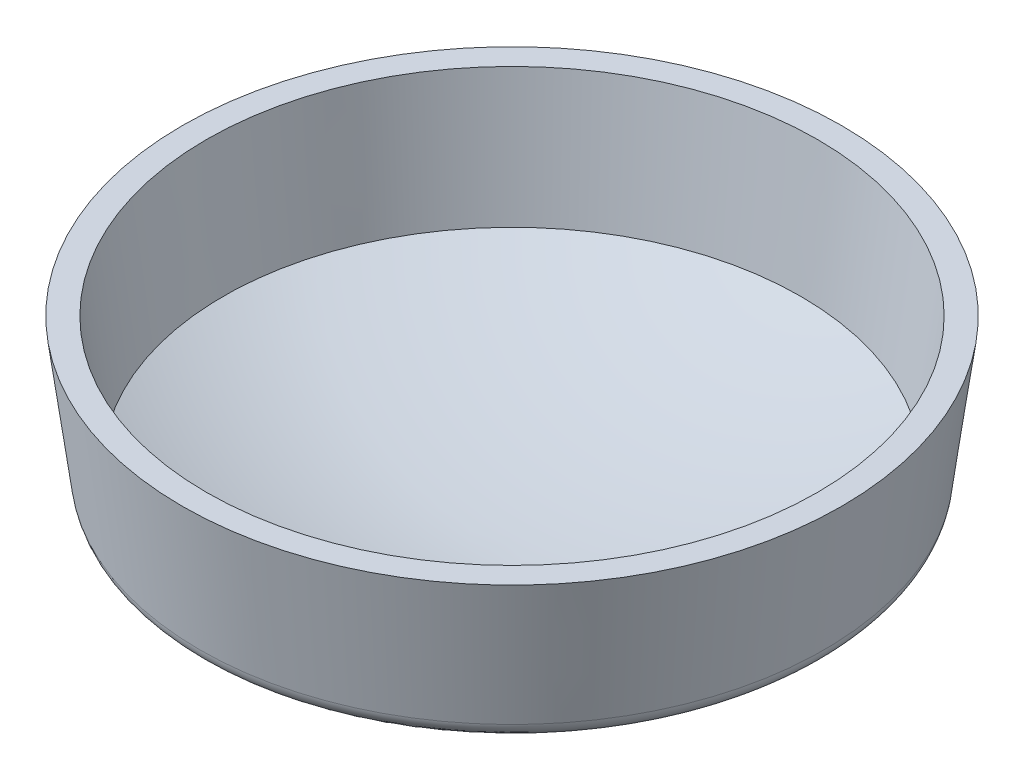
ISO-10303-21;
HEADER;
FILE_DESCRIPTION(('STEP AP214'),'2;1');
FILE_NAME('part.step','',(''),(''),'','','');
FILE_SCHEMA(('AUTOMOTIVE_DESIGN { 1 0 10303 214 1 1 1 1 }'));
ENDSEC;
DATA;
#1=APPLICATION_CONTEXT('core data for automotive mechanical design processes');
#2=APPLICATION_PROTOCOL_DEFINITION('international standard','automotive_design',2000,#1);
#3=PRODUCT_CONTEXT('',#1,'mechanical');
#4=PRODUCT('Part','Part','',(#3));
#5=PRODUCT_RELATED_PRODUCT_CATEGORY('part','',(#4));
#6=PRODUCT_DEFINITION_FORMATION('','',#4);
#7=PRODUCT_DEFINITION_CONTEXT('part definition',#1,'design');
#8=PRODUCT_DEFINITION('design','',#6,#7);
#9=PRODUCT_DEFINITION_SHAPE('','',#8);
#10=(LENGTH_UNIT() NAMED_UNIT(*) SI_UNIT(.MILLI.,.METRE.));
#11=(NAMED_UNIT(*) PLANE_ANGLE_UNIT() SI_UNIT($,.RADIAN.));
#12=(NAMED_UNIT(*) SI_UNIT($,.STERADIAN.) SOLID_ANGLE_UNIT());
#13=UNCERTAINTY_MEASURE_WITH_UNIT(LENGTH_MEASURE(1.E-05),#10,'distance_accuracy_value','');
#14=(GEOMETRIC_REPRESENTATION_CONTEXT(3) GLOBAL_UNCERTAINTY_ASSIGNED_CONTEXT((#13)) GLOBAL_UNIT_ASSIGNED_CONTEXT((#10,
#11,#12)) REPRESENTATION_CONTEXT('',''));
#15=CARTESIAN_POINT('',(0.,0.,0.));
#16=DIRECTION('',(0.,0.,1.));
#17=DIRECTION('',(1.,0.,0.));
#18=AXIS2_PLACEMENT_3D('',#15,#16,#17);
#19=CARTESIAN_POINT('',(0.,84.6666666666666,0.));
#20=DIRECTION('',(0.,0.,1.));
#21=DIRECTION('',(1.,0.,0.));
#22=AXIS2_PLACEMENT_3D('',#19,#20,#21);
#23=SPHERICAL_SURFACE('',#22,94.1916666666666);
#24=CARTESIAN_POINT('',(0.,84.6666666666666,0.));
#25=DIRECTION('',(0.,1.,0.));
#26=DIRECTION('',(0.,0.,1.));
#27=AXIS2_PLACEMENT_3D('',#24,#25,#26);
#28=SPHERICAL_SURFACE('',#27,94.1916666666666);
#29=CARTESIAN_POINT('',(0.,-0.602217901743057,0.));
#30=DIRECTION('',(0.,1.,0.));
#31=DIRECTION('',(0.,0.,1.));
#32=AXIS2_PLACEMENT_3D('',#29,#30,#31);
#33=CIRCLE('',#32,40.0160891880212);
#34=CARTESIAN_POINT('',(0.,-0.602217901743062,40.0160891880212));
#35=VERTEX_POINT('',#34);
#36=EDGE_CURVE('E10',#35,#35,#33,.F.);
#37=ORIENTED_EDGE('',*,*,#36,.T.);
#38=EDGE_LOOP('',(#37));
#39=FACE_BOUND('',#38,.T.);
#40=ADVANCED_FACE('F37',(#39),#28,.T.);
#41=CARTESIAN_POINT('',(0.,0.,0.));
#42=DIRECTION('',(0.,1.,0.));
#43=DIRECTION('',(0.,0.,1.));
#44=AXIS2_PLACEMENT_3D('',#41,#42,#43);
#45=CONICAL_SURFACE('',#44,41.275,0.131248759749971);
#46=CARTESIAN_POINT('',(0.,1.36475219947629,0.));
#47=DIRECTION('',(0.,-1.,0.));
#48=DIRECTION('',(0.,0.,-1.));
#49=AXIS2_PLACEMENT_3D('',#46,#47,#48);
#50=CIRCLE('',#49,41.4551577032734);
#51=CARTESIAN_POINT('',(0.,1.3647521994763,-41.4551577032734));
#52=VERTEX_POINT('',#51);
#53=EDGE_CURVE('E44',#52,#52,#50,.F.);
#54=ORIENTED_EDGE('',*,*,#53,.T.);
#55=EDGE_LOOP('',(#54));
#56=FACE_BOUND('',#55,.T.);
#57=CARTESIAN_POINT('',(0.,19.05,0.));
#58=DIRECTION('',(0.,1.,0.));
#59=DIRECTION('',(0.,0.,1.));
#60=AXIS2_PLACEMENT_3D('',#57,#58,#59);
#61=CIRCLE('',#60,43.7897453498706);
#62=CARTESIAN_POINT('',(0.,19.05,43.7897453498706));
#63=VERTEX_POINT('',#62);
#64=EDGE_CURVE('E48',#63,#63,#61,.T.);
#65=ORIENTED_EDGE('',*,*,#64,.F.);
#66=EDGE_LOOP('',(#65));
#67=FACE_BOUND('',#66,.T.);
#68=ADVANCED_FACE('F72',(#56,#67),#45,.T.);
#69=CARTESIAN_POINT('',(0.,19.05,-43.7897453498706));
#70=DIRECTION('',(0.,-1.,0.));
#71=DIRECTION('',(0.,0.,-1.));
#72=AXIS2_PLACEMENT_3D('',#69,#70,#71);
#73=PLANE('',#72);
#74=CARTESIAN_POINT('',(0.,19.05,0.));
#75=DIRECTION('',(0.,-1.,0.));
#76=DIRECTION('',(0.,0.,-1.));
#77=AXIS2_PLACEMENT_3D('',#74,#75,#76);
#78=CIRCLE('',#77,40.587201030745);
#79=CARTESIAN_POINT('',(0.,19.05,-40.587201030745));
#80=VERTEX_POINT('',#79);
#81=EDGE_CURVE('E55',#80,#80,#78,.F.);
#82=ORIENTED_EDGE('',*,*,#81,.F.);
#83=EDGE_LOOP('',(#82));
#84=FACE_BOUND('',#83,.T.);
#85=ORIENTED_EDGE('',*,*,#64,.T.);
#86=EDGE_LOOP('',(#85));
#87=FACE_BOUND('',#86,.T.);
#88=ADVANCED_FACE('F69',(#84,#87),#73,.F.);
#89=CARTESIAN_POINT('',(0.,1.69716774953987,0.));
#90=DIRECTION('',(0.,1.,0.));
#91=DIRECTION('',(0.,0.,1.));
#92=AXIS2_PLACEMENT_3D('',#89,#90,#91);
#93=TOROIDAL_SURFACE('',#92,38.9370036368835,2.54);
#94=ORIENTED_EDGE('',*,*,#36,.F.);
#95=EDGE_LOOP('',(#94));
#96=FACE_BOUND('',#95,.T.);
#97=ORIENTED_EDGE('',*,*,#53,.F.);
#98=EDGE_LOOP('',(#97));
#99=FACE_BOUND('',#98,.T.);
#100=ADVANCED_FACE('F39',(#96,#99),#93,.T.);
#101=CARTESIAN_POINT('',(0.,84.6666666666666,0.));
#102=DIRECTION('',(0.,0.,1.));
#103=DIRECTION('',(1.,0.,0.));
#104=AXIS2_PLACEMENT_3D('',#101,#102,#103);
#105=SPHERICAL_SURFACE('',#104,91.0166666666666);
#106=CARTESIAN_POINT('',(0.,84.6666666666666,0.));
#107=DIRECTION('',(0.,1.,0.));
#108=DIRECTION('',(0.,0.,1.));
#109=AXIS2_PLACEMENT_3D('',#106,#107,#108);
#110=SPHERICAL_SURFACE('',#109,91.0166666666666);
#111=CARTESIAN_POINT('',(0.,2.12528122677848,0.));
#112=DIRECTION('',(0.,1.,0.));
#113=DIRECTION('',(0.,0.,1.));
#114=AXIS2_PLACEMENT_3D('',#111,#112,#113);
#115=CIRCLE('',#114,38.3530090185231);
#116=CARTESIAN_POINT('',(0.,2.12528122677847,38.3530090185231));
#117=VERTEX_POINT('',#116);
#118=EDGE_CURVE('E52',#117,#117,#115,.T.);
#119=ORIENTED_EDGE('',*,*,#118,.T.);
#120=EDGE_LOOP('',(#119));
#121=FACE_BOUND('',#120,.T.);
#122=ADVANCED_FACE('F61',(#121),#110,.F.);
#123=CARTESIAN_POINT('',(0.,0.415519437579502,0.));
#124=DIRECTION('',(0.,1.,0.));
#125=DIRECTION('',(0.,0.,1.));
#126=AXIS2_PLACEMENT_3D('',#123,#124,#125);
#127=CONICAL_SURFACE('',#126,38.1273074170126,0.131248759749971);
#128=ORIENTED_EDGE('',*,*,#118,.F.);
#129=EDGE_LOOP('',(#128));
#130=FACE_BOUND('',#129,.T.);
#131=ORIENTED_EDGE('',*,*,#81,.T.);
#132=EDGE_LOOP('',(#131));
#133=FACE_BOUND('',#132,.T.);
#134=ADVANCED_FACE('F63',(#130,#133),#127,.F.);
#135=CLOSED_SHELL('',(#40,#68,#88,#100,#122,#134));
#136=MANIFOLD_SOLID_BREP('B2',#135);
#137=ADVANCED_BREP_SHAPE_REPRESENTATION('',(#18,#136),#14);
#138=SHAPE_DEFINITION_REPRESENTATION(#9,#137);
ENDSEC;
END-ISO-10303-21;
